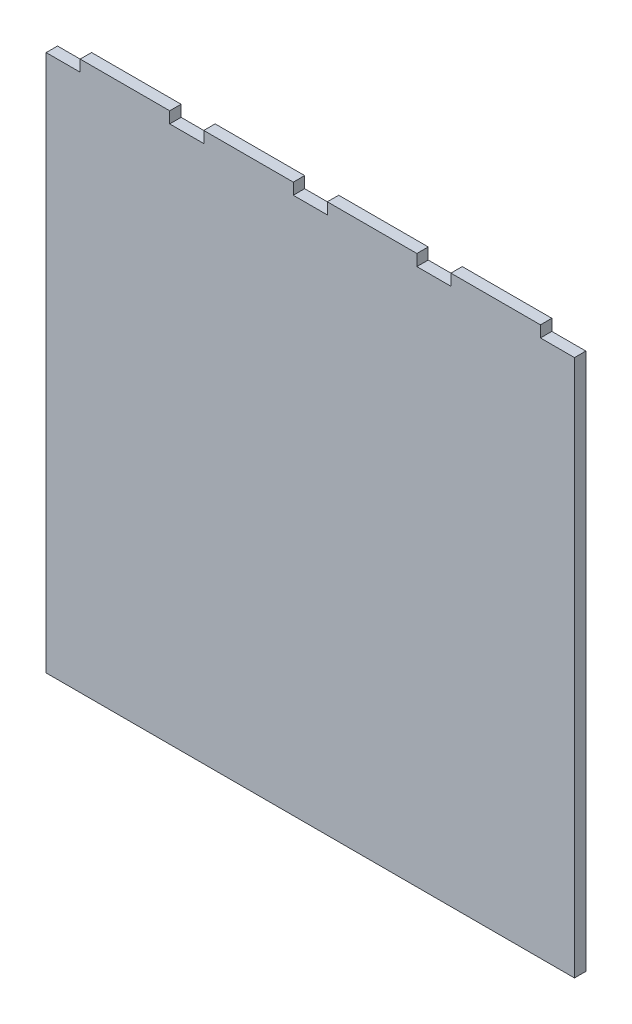
ISO-10303-21;
HEADER;
FILE_DESCRIPTION(('STEP AP214'),'2;1');
FILE_NAME('part.step','',(''),(''),'','','');
FILE_SCHEMA(('AUTOMOTIVE_DESIGN { 1 0 10303 214 1 1 1 1 }'));
ENDSEC;
DATA;
#1=APPLICATION_CONTEXT('core data for automotive mechanical design processes');
#2=APPLICATION_PROTOCOL_DEFINITION('international standard','automotive_design',2000,#1);
#3=PRODUCT_CONTEXT('',#1,'mechanical');
#4=PRODUCT('Part','Part','',(#3));
#5=PRODUCT_RELATED_PRODUCT_CATEGORY('part','',(#4));
#6=PRODUCT_DEFINITION_FORMATION('','',#4);
#7=PRODUCT_DEFINITION_CONTEXT('part definition',#1,'design');
#8=PRODUCT_DEFINITION('design','',#6,#7);
#9=PRODUCT_DEFINITION_SHAPE('','',#8);
#10=(LENGTH_UNIT() NAMED_UNIT(*) SI_UNIT(.MILLI.,.METRE.));
#11=(NAMED_UNIT(*) PLANE_ANGLE_UNIT() SI_UNIT($,.RADIAN.));
#12=(NAMED_UNIT(*) SI_UNIT($,.STERADIAN.) SOLID_ANGLE_UNIT());
#13=UNCERTAINTY_MEASURE_WITH_UNIT(LENGTH_MEASURE(1.E-05),#10,'distance_accuracy_value','');
#14=(GEOMETRIC_REPRESENTATION_CONTEXT(3) GLOBAL_UNCERTAINTY_ASSIGNED_CONTEXT((#13)) GLOBAL_UNIT_ASSIGNED_CONTEXT((#10,
#11,#12)) REPRESENTATION_CONTEXT('',''));
#15=CARTESIAN_POINT('',(0.,0.,0.));
#16=DIRECTION('',(0.,0.,1.));
#17=DIRECTION('',(1.,0.,0.));
#18=AXIS2_PLACEMENT_3D('',#15,#16,#17);
#19=CARTESIAN_POINT('',(0.,0.,6.35));
#20=DIRECTION('',(1.,0.,0.));
#21=DIRECTION('',(0.,1.,0.));
#22=AXIS2_PLACEMENT_3D('',#19,#20,#21);
#23=PLANE('',#22);
#24=DIRECTION('',(0.,-1.,0.));
#25=VECTOR('',#24,1.);
#26=CARTESIAN_POINT('',(0.,0.,0.));
#27=LINE('',#26,#25);
#28=CARTESIAN_POINT('',(0.,0.,0.));
#29=VERTEX_POINT('',#28);
#30=CARTESIAN_POINT('',(0.,-300.,0.));
#31=VERTEX_POINT('',#30);
#32=EDGE_CURVE('E201',#29,#31,#27,.T.);
#33=ORIENTED_EDGE('',*,*,#32,.T.);
#34=DIRECTION('',(0.,0.,-1.));
#35=VECTOR('',#34,1.);
#36=CARTESIAN_POINT('',(0.,-300.,6.35));
#37=LINE('',#36,#35);
#38=CARTESIAN_POINT('',(0.,-300.,6.35));
#39=VERTEX_POINT('',#38);
#40=EDGE_CURVE('E11',#39,#31,#37,.T.);
#41=ORIENTED_EDGE('',*,*,#40,.F.);
#42=DIRECTION('',(0.,-1.,0.));
#43=VECTOR('',#42,1.);
#44=CARTESIAN_POINT('',(0.,0.,6.35));
#45=LINE('',#44,#43);
#46=CARTESIAN_POINT('',(0.,0.,6.35));
#47=VERTEX_POINT('',#46);
#48=EDGE_CURVE('E239',#47,#39,#45,.T.);
#49=ORIENTED_EDGE('',*,*,#48,.F.);
#50=DIRECTION('',(0.,0.,-1.));
#51=VECTOR('',#50,1.);
#52=CARTESIAN_POINT('',(0.,0.,6.35));
#53=LINE('',#52,#51);
#54=EDGE_CURVE('E197',#47,#29,#53,.T.);
#55=ORIENTED_EDGE('',*,*,#54,.T.);
#56=EDGE_LOOP('',(#33,#41,#49,#55));
#57=FACE_BOUND('',#56,.T.);
#58=ADVANCED_FACE('F33',(#57),#23,.F.);
#59=CARTESIAN_POINT('',(0.,-300.,6.35));
#60=DIRECTION('',(0.,1.,0.));
#61=DIRECTION('',(0.,0.,1.));
#62=AXIS2_PLACEMENT_3D('',#59,#60,#61);
#63=PLANE('',#62);
#64=DIRECTION('',(1.,0.,0.));
#65=VECTOR('',#64,1.);
#66=CARTESIAN_POINT('',(0.,-300.,0.));
#67=LINE('',#66,#65);
#68=CARTESIAN_POINT('',(295.,-300.,0.));
#69=VERTEX_POINT('',#68);
#70=EDGE_CURVE('E204',#31,#69,#67,.T.);
#71=ORIENTED_EDGE('',*,*,#70,.T.);
#72=DIRECTION('',(0.,0.,-1.));
#73=VECTOR('',#72,1.);
#74=CARTESIAN_POINT('',(295.,-300.,6.35));
#75=LINE('',#74,#73);
#76=CARTESIAN_POINT('',(295.,-300.,6.35));
#77=VERTEX_POINT('',#76);
#78=EDGE_CURVE('E41',#77,#69,#75,.T.);
#79=ORIENTED_EDGE('',*,*,#78,.F.);
#80=DIRECTION('',(1.,0.,0.));
#81=VECTOR('',#80,1.);
#82=CARTESIAN_POINT('',(0.,-300.,6.35));
#83=LINE('',#82,#81);
#84=EDGE_CURVE('E128',#39,#77,#83,.T.);
#85=ORIENTED_EDGE('',*,*,#84,.F.);
#86=ORIENTED_EDGE('',*,*,#40,.T.);
#87=EDGE_LOOP('',(#71,#79,#85,#86));
#88=FACE_BOUND('',#87,.T.);
#89=ADVANCED_FACE('F357',(#88),#63,.F.);
#90=CARTESIAN_POINT('',(295.,0.,6.35));
#91=DIRECTION('',(-1.,0.,0.));
#92=DIRECTION('',(0.,-1.,0.));
#93=AXIS2_PLACEMENT_3D('',#90,#91,#92);
#94=PLANE('',#93);
#95=DIRECTION('',(0.,1.,0.));
#96=VECTOR('',#95,1.);
#97=CARTESIAN_POINT('',(295.,0.,0.));
#98=LINE('',#97,#96);
#99=CARTESIAN_POINT('',(295.,0.,0.));
#100=VERTEX_POINT('',#99);
#101=EDGE_CURVE('E206',#69,#100,#98,.T.);
#102=ORIENTED_EDGE('',*,*,#101,.T.);
#103=DIRECTION('',(0.,0.,-1.));
#104=VECTOR('',#103,1.);
#105=CARTESIAN_POINT('',(295.,0.,6.35));
#106=LINE('',#105,#104);
#107=CARTESIAN_POINT('',(295.,0.,6.35));
#108=VERTEX_POINT('',#107);
#109=EDGE_CURVE('E282',#108,#100,#106,.T.);
#110=ORIENTED_EDGE('',*,*,#109,.F.);
#111=DIRECTION('',(0.,1.,0.));
#112=VECTOR('',#111,1.);
#113=CARTESIAN_POINT('',(295.,0.,6.35));
#114=LINE('',#113,#112);
#115=EDGE_CURVE('E290',#77,#108,#114,.T.);
#116=ORIENTED_EDGE('',*,*,#115,.F.);
#117=ORIENTED_EDGE('',*,*,#78,.T.);
#118=EDGE_LOOP('',(#102,#110,#116,#117));
#119=FACE_BOUND('',#118,.T.);
#120=ADVANCED_FACE('F288',(#119),#94,.F.);
#121=CARTESIAN_POINT('',(276.,0.,6.35));
#122=DIRECTION('',(0.,-1.,0.));
#123=DIRECTION('',(0.,0.,-1.));
#124=AXIS2_PLACEMENT_3D('',#121,#122,#123);
#125=PLANE('',#124);
#126=DIRECTION('',(-1.,0.,0.));
#127=VECTOR('',#126,1.);
#128=CARTESIAN_POINT('',(276.,0.,0.));
#129=LINE('',#128,#127);
#130=CARTESIAN_POINT('',(276.,0.,0.));
#131=VERTEX_POINT('',#130);
#132=EDGE_CURVE('E208',#100,#131,#129,.T.);
#133=ORIENTED_EDGE('',*,*,#132,.T.);
#134=DIRECTION('',(0.,0.,-1.));
#135=VECTOR('',#134,1.);
#136=CARTESIAN_POINT('',(276.,0.,6.35));
#137=LINE('',#136,#135);
#138=CARTESIAN_POINT('',(276.,0.,6.35));
#139=VERTEX_POINT('',#138);
#140=EDGE_CURVE('E279',#139,#131,#137,.T.);
#141=ORIENTED_EDGE('',*,*,#140,.F.);
#142=DIRECTION('',(-1.,0.,0.));
#143=VECTOR('',#142,1.);
#144=CARTESIAN_POINT('',(276.,0.,6.35));
#145=LINE('',#144,#143);
#146=EDGE_CURVE('E308',#108,#139,#145,.T.);
#147=ORIENTED_EDGE('',*,*,#146,.F.);
#148=ORIENTED_EDGE('',*,*,#109,.T.);
#149=EDGE_LOOP('',(#133,#141,#147,#148));
#150=FACE_BOUND('',#149,.T.);
#151=ADVANCED_FACE('F299',(#150),#125,.F.);
#152=CARTESIAN_POINT('',(276.,0.,6.35));
#153=DIRECTION('',(-1.,0.,0.));
#154=DIRECTION('',(0.,0.,1.));
#155=AXIS2_PLACEMENT_3D('',#152,#153,#154);
#156=PLANE('',#155);
#157=DIRECTION('',(0.,1.,0.));
#158=VECTOR('',#157,1.);
#159=CARTESIAN_POINT('',(276.,0.,0.));
#160=LINE('',#159,#158);
#161=CARTESIAN_POINT('',(276.,6.35,0.));
#162=VERTEX_POINT('',#161);
#163=EDGE_CURVE('E210',#131,#162,#160,.T.);
#164=ORIENTED_EDGE('',*,*,#163,.T.);
#165=DIRECTION('',(0.,0.,-1.));
#166=VECTOR('',#165,1.);
#167=CARTESIAN_POINT('',(276.,6.35,6.35));
#168=LINE('',#167,#166);
#169=CARTESIAN_POINT('',(276.,6.35,6.35));
#170=VERTEX_POINT('',#169);
#171=EDGE_CURVE('E276',#170,#162,#168,.T.);
#172=ORIENTED_EDGE('',*,*,#171,.F.);
#173=DIRECTION('',(0.,1.,0.));
#174=VECTOR('',#173,1.);
#175=CARTESIAN_POINT('',(276.,0.,6.35));
#176=LINE('',#175,#174);
#177=EDGE_CURVE('E305',#139,#170,#176,.T.);
#178=ORIENTED_EDGE('',*,*,#177,.F.);
#179=ORIENTED_EDGE('',*,*,#140,.T.);
#180=EDGE_LOOP('',(#164,#172,#178,#179));
#181=FACE_BOUND('',#180,.T.);
#182=ADVANCED_FACE('F303',(#181),#156,.F.);
#183=CARTESIAN_POINT('',(226.,6.35,6.35));
#184=DIRECTION('',(0.,-1.,0.));
#185=DIRECTION('',(0.,0.,-1.));
#186=AXIS2_PLACEMENT_3D('',#183,#184,#185);
#187=PLANE('',#186);
#188=DIRECTION('',(-1.,0.,0.));
#189=VECTOR('',#188,1.);
#190=CARTESIAN_POINT('',(226.,6.35,0.));
#191=LINE('',#190,#189);
#192=CARTESIAN_POINT('',(226.,6.35,0.));
#193=VERTEX_POINT('',#192);
#194=EDGE_CURVE('E212',#162,#193,#191,.T.);
#195=ORIENTED_EDGE('',*,*,#194,.T.);
#196=DIRECTION('',(0.,0.,-1.));
#197=VECTOR('',#196,1.);
#198=CARTESIAN_POINT('',(226.,6.35,6.35));
#199=LINE('',#198,#197);
#200=CARTESIAN_POINT('',(226.,6.35,6.35));
#201=VERTEX_POINT('',#200);
#202=EDGE_CURVE('E273',#201,#193,#199,.T.);
#203=ORIENTED_EDGE('',*,*,#202,.F.);
#204=DIRECTION('',(-1.,0.,0.));
#205=VECTOR('',#204,1.);
#206=CARTESIAN_POINT('',(226.,6.35,6.35));
#207=LINE('',#206,#205);
#208=EDGE_CURVE('E307',#170,#201,#207,.T.);
#209=ORIENTED_EDGE('',*,*,#208,.F.);
#210=ORIENTED_EDGE('',*,*,#171,.T.);
#211=EDGE_LOOP('',(#195,#203,#209,#210));
#212=FACE_BOUND('',#211,.T.);
#213=ADVANCED_FACE('F370',(#212),#187,.F.);
#214=CARTESIAN_POINT('',(226.,0.,6.35));
#215=DIRECTION('',(1.,0.,0.));
#216=DIRECTION('',(0.,0.,-1.));
#217=AXIS2_PLACEMENT_3D('',#214,#215,#216);
#218=PLANE('',#217);
#219=DIRECTION('',(0.,-1.,0.));
#220=VECTOR('',#219,1.);
#221=CARTESIAN_POINT('',(226.,0.,0.));
#222=LINE('',#221,#220);
#223=CARTESIAN_POINT('',(226.,0.,0.));
#224=VERTEX_POINT('',#223);
#225=EDGE_CURVE('E214',#193,#224,#222,.T.);
#226=ORIENTED_EDGE('',*,*,#225,.T.);
#227=DIRECTION('',(0.,0.,-1.));
#228=VECTOR('',#227,1.);
#229=CARTESIAN_POINT('',(226.,0.,6.35));
#230=LINE('',#229,#228);
#231=CARTESIAN_POINT('',(226.,0.,6.35));
#232=VERTEX_POINT('',#231);
#233=EDGE_CURVE('E270',#232,#224,#230,.T.);
#234=ORIENTED_EDGE('',*,*,#233,.F.);
#235=DIRECTION('',(0.,-1.,0.));
#236=VECTOR('',#235,1.);
#237=CARTESIAN_POINT('',(226.,0.,6.35));
#238=LINE('',#237,#236);
#239=EDGE_CURVE('E310',#201,#232,#238,.T.);
#240=ORIENTED_EDGE('',*,*,#239,.F.);
#241=ORIENTED_EDGE('',*,*,#202,.T.);
#242=EDGE_LOOP('',(#226,#234,#240,#241));
#243=FACE_BOUND('',#242,.T.);
#244=ADVANCED_FACE('F373',(#243),#218,.F.);
#245=CARTESIAN_POINT('',(207.,0.,6.35));
#246=DIRECTION('',(0.,-1.,0.));
#247=DIRECTION('',(0.,0.,-1.));
#248=AXIS2_PLACEMENT_3D('',#245,#246,#247);
#249=PLANE('',#248);
#250=DIRECTION('',(-1.,0.,0.));
#251=VECTOR('',#250,1.);
#252=CARTESIAN_POINT('',(207.,0.,0.));
#253=LINE('',#252,#251);
#254=CARTESIAN_POINT('',(207.,0.,0.));
#255=VERTEX_POINT('',#254);
#256=EDGE_CURVE('E216',#224,#255,#253,.T.);
#257=ORIENTED_EDGE('',*,*,#256,.T.);
#258=DIRECTION('',(0.,0.,-1.));
#259=VECTOR('',#258,1.);
#260=CARTESIAN_POINT('',(207.,0.,6.35));
#261=LINE('',#260,#259);
#262=CARTESIAN_POINT('',(207.,0.,6.35));
#263=VERTEX_POINT('',#262);
#264=EDGE_CURVE('E267',#263,#255,#261,.T.);
#265=ORIENTED_EDGE('',*,*,#264,.F.);
#266=DIRECTION('',(-1.,0.,0.));
#267=VECTOR('',#266,1.);
#268=CARTESIAN_POINT('',(207.,0.,6.35));
#269=LINE('',#268,#267);
#270=EDGE_CURVE('E316',#232,#263,#269,.T.);
#271=ORIENTED_EDGE('',*,*,#270,.F.);
#272=ORIENTED_EDGE('',*,*,#233,.T.);
#273=EDGE_LOOP('',(#257,#265,#271,#272));
#274=FACE_BOUND('',#273,.T.);
#275=ADVANCED_FACE('F377',(#274),#249,.F.);
#276=CARTESIAN_POINT('',(207.,0.,6.35));
#277=DIRECTION('',(-1.,0.,0.));
#278=DIRECTION('',(0.,0.,1.));
#279=AXIS2_PLACEMENT_3D('',#276,#277,#278);
#280=PLANE('',#279);
#281=DIRECTION('',(0.,1.,0.));
#282=VECTOR('',#281,1.);
#283=CARTESIAN_POINT('',(207.,0.,0.));
#284=LINE('',#283,#282);
#285=CARTESIAN_POINT('',(207.,6.35,0.));
#286=VERTEX_POINT('',#285);
#287=EDGE_CURVE('E218',#255,#286,#284,.T.);
#288=ORIENTED_EDGE('',*,*,#287,.T.);
#289=DIRECTION('',(0.,0.,-1.));
#290=VECTOR('',#289,1.);
#291=CARTESIAN_POINT('',(207.,6.35,6.35));
#292=LINE('',#291,#290);
#293=CARTESIAN_POINT('',(207.,6.35,6.35));
#294=VERTEX_POINT('',#293);
#295=EDGE_CURVE('E264',#294,#286,#292,.T.);
#296=ORIENTED_EDGE('',*,*,#295,.F.);
#297=DIRECTION('',(0.,1.,0.));
#298=VECTOR('',#297,1.);
#299=CARTESIAN_POINT('',(207.,0.,6.35));
#300=LINE('',#299,#298);
#301=EDGE_CURVE('E318',#263,#294,#300,.T.);
#302=ORIENTED_EDGE('',*,*,#301,.F.);
#303=ORIENTED_EDGE('',*,*,#264,.T.);
#304=EDGE_LOOP('',(#288,#296,#302,#303));
#305=FACE_BOUND('',#304,.T.);
#306=ADVANCED_FACE('F381',(#305),#280,.F.);
#307=CARTESIAN_POINT('',(157.,6.35,6.35));
#308=DIRECTION('',(0.,-1.,0.));
#309=DIRECTION('',(0.,0.,-1.));
#310=AXIS2_PLACEMENT_3D('',#307,#308,#309);
#311=PLANE('',#310);
#312=DIRECTION('',(-1.,0.,0.));
#313=VECTOR('',#312,1.);
#314=CARTESIAN_POINT('',(157.,6.35,0.));
#315=LINE('',#314,#313);
#316=CARTESIAN_POINT('',(157.,6.35,0.));
#317=VERTEX_POINT('',#316);
#318=EDGE_CURVE('E220',#286,#317,#315,.T.);
#319=ORIENTED_EDGE('',*,*,#318,.T.);
#320=DIRECTION('',(0.,0.,-1.));
#321=VECTOR('',#320,1.);
#322=CARTESIAN_POINT('',(157.,6.35,6.35));
#323=LINE('',#322,#321);
#324=CARTESIAN_POINT('',(157.,6.35,6.35));
#325=VERTEX_POINT('',#324);
#326=EDGE_CURVE('E261',#325,#317,#323,.T.);
#327=ORIENTED_EDGE('',*,*,#326,.F.);
#328=DIRECTION('',(-1.,0.,0.));
#329=VECTOR('',#328,1.);
#330=CARTESIAN_POINT('',(157.,6.35,6.35));
#331=LINE('',#330,#329);
#332=EDGE_CURVE('E320',#294,#325,#331,.T.);
#333=ORIENTED_EDGE('',*,*,#332,.F.);
#334=ORIENTED_EDGE('',*,*,#295,.T.);
#335=EDGE_LOOP('',(#319,#327,#333,#334));
#336=FACE_BOUND('',#335,.T.);
#337=ADVANCED_FACE('F385',(#336),#311,.F.);
#338=CARTESIAN_POINT('',(157.,0.,6.35));
#339=DIRECTION('',(1.,0.,0.));
#340=DIRECTION('',(0.,0.,-1.));
#341=AXIS2_PLACEMENT_3D('',#338,#339,#340);
#342=PLANE('',#341);
#343=DIRECTION('',(0.,-1.,0.));
#344=VECTOR('',#343,1.);
#345=CARTESIAN_POINT('',(157.,0.,0.));
#346=LINE('',#345,#344);
#347=CARTESIAN_POINT('',(157.,0.,0.));
#348=VERTEX_POINT('',#347);
#349=EDGE_CURVE('E222',#317,#348,#346,.T.);
#350=ORIENTED_EDGE('',*,*,#349,.T.);
#351=DIRECTION('',(0.,0.,-1.));
#352=VECTOR('',#351,1.);
#353=CARTESIAN_POINT('',(157.,0.,6.35));
#354=LINE('',#353,#352);
#355=CARTESIAN_POINT('',(157.,0.,6.35));
#356=VERTEX_POINT('',#355);
#357=EDGE_CURVE('E258',#356,#348,#354,.T.);
#358=ORIENTED_EDGE('',*,*,#357,.F.);
#359=DIRECTION('',(0.,-1.,0.));
#360=VECTOR('',#359,1.);
#361=CARTESIAN_POINT('',(157.,0.,6.35));
#362=LINE('',#361,#360);
#363=EDGE_CURVE('E322',#325,#356,#362,.T.);
#364=ORIENTED_EDGE('',*,*,#363,.F.);
#365=ORIENTED_EDGE('',*,*,#326,.T.);
#366=EDGE_LOOP('',(#350,#358,#364,#365));
#367=FACE_BOUND('',#366,.T.);
#368=ADVANCED_FACE('F389',(#367),#342,.F.);
#369=CARTESIAN_POINT('',(138.,0.,6.35));
#370=DIRECTION('',(0.,-1.,0.));
#371=DIRECTION('',(0.,0.,-1.));
#372=AXIS2_PLACEMENT_3D('',#369,#370,#371);
#373=PLANE('',#372);
#374=DIRECTION('',(-1.,0.,0.));
#375=VECTOR('',#374,1.);
#376=CARTESIAN_POINT('',(138.,0.,0.));
#377=LINE('',#376,#375);
#378=CARTESIAN_POINT('',(138.,0.,0.));
#379=VERTEX_POINT('',#378);
#380=EDGE_CURVE('E224',#348,#379,#377,.T.);
#381=ORIENTED_EDGE('',*,*,#380,.T.);
#382=DIRECTION('',(0.,0.,-1.));
#383=VECTOR('',#382,1.);
#384=CARTESIAN_POINT('',(138.,0.,6.35));
#385=LINE('',#384,#383);
#386=CARTESIAN_POINT('',(138.,0.,6.35));
#387=VERTEX_POINT('',#386);
#388=EDGE_CURVE('E255',#387,#379,#385,.T.);
#389=ORIENTED_EDGE('',*,*,#388,.F.);
#390=DIRECTION('',(-1.,0.,0.));
#391=VECTOR('',#390,1.);
#392=CARTESIAN_POINT('',(138.,0.,6.35));
#393=LINE('',#392,#391);
#394=EDGE_CURVE('E324',#356,#387,#393,.T.);
#395=ORIENTED_EDGE('',*,*,#394,.F.);
#396=ORIENTED_EDGE('',*,*,#357,.T.);
#397=EDGE_LOOP('',(#381,#389,#395,#396));
#398=FACE_BOUND('',#397,.T.);
#399=ADVANCED_FACE('F393',(#398),#373,.F.);
#400=CARTESIAN_POINT('',(138.,0.,6.35));
#401=DIRECTION('',(-1.,0.,0.));
#402=DIRECTION('',(0.,0.,1.));
#403=AXIS2_PLACEMENT_3D('',#400,#401,#402);
#404=PLANE('',#403);
#405=DIRECTION('',(0.,1.,0.));
#406=VECTOR('',#405,1.);
#407=CARTESIAN_POINT('',(138.,0.,0.));
#408=LINE('',#407,#406);
#409=CARTESIAN_POINT('',(138.,6.35,0.));
#410=VERTEX_POINT('',#409);
#411=EDGE_CURVE('E226',#379,#410,#408,.T.);
#412=ORIENTED_EDGE('',*,*,#411,.T.);
#413=DIRECTION('',(0.,0.,-1.));
#414=VECTOR('',#413,1.);
#415=CARTESIAN_POINT('',(138.,6.35,6.35));
#416=LINE('',#415,#414);
#417=CARTESIAN_POINT('',(138.,6.35,6.35));
#418=VERTEX_POINT('',#417);
#419=EDGE_CURVE('E252',#418,#410,#416,.T.);
#420=ORIENTED_EDGE('',*,*,#419,.F.);
#421=DIRECTION('',(0.,1.,0.));
#422=VECTOR('',#421,1.);
#423=CARTESIAN_POINT('',(138.,0.,6.35));
#424=LINE('',#423,#422);
#425=EDGE_CURVE('E326',#387,#418,#424,.T.);
#426=ORIENTED_EDGE('',*,*,#425,.F.);
#427=ORIENTED_EDGE('',*,*,#388,.T.);
#428=EDGE_LOOP('',(#412,#420,#426,#427));
#429=FACE_BOUND('',#428,.T.);
#430=ADVANCED_FACE('F397',(#429),#404,.F.);
#431=CARTESIAN_POINT('',(88.,6.35,6.35));
#432=DIRECTION('',(0.,-1.,0.));
#433=DIRECTION('',(0.,0.,-1.));
#434=AXIS2_PLACEMENT_3D('',#431,#432,#433);
#435=PLANE('',#434);
#436=DIRECTION('',(-1.,0.,0.));
#437=VECTOR('',#436,1.);
#438=CARTESIAN_POINT('',(88.,6.35,0.));
#439=LINE('',#438,#437);
#440=CARTESIAN_POINT('',(88.,6.35,0.));
#441=VERTEX_POINT('',#440);
#442=EDGE_CURVE('E228',#410,#441,#439,.T.);
#443=ORIENTED_EDGE('',*,*,#442,.T.);
#444=DIRECTION('',(0.,0.,-1.));
#445=VECTOR('',#444,1.);
#446=CARTESIAN_POINT('',(88.,6.35,6.35));
#447=LINE('',#446,#445);
#448=CARTESIAN_POINT('',(88.,6.35,6.35));
#449=VERTEX_POINT('',#448);
#450=EDGE_CURVE('E249',#449,#441,#447,.T.);
#451=ORIENTED_EDGE('',*,*,#450,.F.);
#452=DIRECTION('',(-1.,0.,0.));
#453=VECTOR('',#452,1.);
#454=CARTESIAN_POINT('',(88.,6.35,6.35));
#455=LINE('',#454,#453);
#456=EDGE_CURVE('E328',#418,#449,#455,.T.);
#457=ORIENTED_EDGE('',*,*,#456,.F.);
#458=ORIENTED_EDGE('',*,*,#419,.T.);
#459=EDGE_LOOP('',(#443,#451,#457,#458));
#460=FACE_BOUND('',#459,.T.);
#461=ADVANCED_FACE('F401',(#460),#435,.F.);
#462=CARTESIAN_POINT('',(88.,0.,6.35));
#463=DIRECTION('',(1.,0.,0.));
#464=DIRECTION('',(0.,0.,-1.));
#465=AXIS2_PLACEMENT_3D('',#462,#463,#464);
#466=PLANE('',#465);
#467=DIRECTION('',(0.,-1.,0.));
#468=VECTOR('',#467,1.);
#469=CARTESIAN_POINT('',(88.,0.,0.));
#470=LINE('',#469,#468);
#471=CARTESIAN_POINT('',(88.,0.,0.));
#472=VERTEX_POINT('',#471);
#473=EDGE_CURVE('E230',#441,#472,#470,.T.);
#474=ORIENTED_EDGE('',*,*,#473,.T.);
#475=DIRECTION('',(0.,0.,-1.));
#476=VECTOR('',#475,1.);
#477=CARTESIAN_POINT('',(88.,0.,6.35));
#478=LINE('',#477,#476);
#479=CARTESIAN_POINT('',(88.,0.,6.35));
#480=VERTEX_POINT('',#479);
#481=EDGE_CURVE('E246',#480,#472,#478,.T.);
#482=ORIENTED_EDGE('',*,*,#481,.F.);
#483=DIRECTION('',(0.,-1.,0.));
#484=VECTOR('',#483,1.);
#485=CARTESIAN_POINT('',(88.,0.,6.35));
#486=LINE('',#485,#484);
#487=EDGE_CURVE('E330',#449,#480,#486,.T.);
#488=ORIENTED_EDGE('',*,*,#487,.F.);
#489=ORIENTED_EDGE('',*,*,#450,.T.);
#490=EDGE_LOOP('',(#474,#482,#488,#489));
#491=FACE_BOUND('',#490,.T.);
#492=ADVANCED_FACE('F405',(#491),#466,.F.);
#493=CARTESIAN_POINT('',(69.,0.,6.35));
#494=DIRECTION('',(0.,-1.,0.));
#495=DIRECTION('',(0.,0.,-1.));
#496=AXIS2_PLACEMENT_3D('',#493,#494,#495);
#497=PLANE('',#496);
#498=DIRECTION('',(-1.,0.,0.));
#499=VECTOR('',#498,1.);
#500=CARTESIAN_POINT('',(69.,0.,0.));
#501=LINE('',#500,#499);
#502=CARTESIAN_POINT('',(69.,0.,0.));
#503=VERTEX_POINT('',#502);
#504=EDGE_CURVE('E232',#472,#503,#501,.T.);
#505=ORIENTED_EDGE('',*,*,#504,.T.);
#506=DIRECTION('',(0.,0.,-1.));
#507=VECTOR('',#506,1.);
#508=CARTESIAN_POINT('',(69.,0.,6.35));
#509=LINE('',#508,#507);
#510=CARTESIAN_POINT('',(69.,0.,6.35));
#511=VERTEX_POINT('',#510);
#512=EDGE_CURVE('E243',#511,#503,#509,.T.);
#513=ORIENTED_EDGE('',*,*,#512,.F.);
#514=DIRECTION('',(-1.,0.,0.));
#515=VECTOR('',#514,1.);
#516=CARTESIAN_POINT('',(69.,0.,6.35));
#517=LINE('',#516,#515);
#518=EDGE_CURVE('E332',#480,#511,#517,.T.);
#519=ORIENTED_EDGE('',*,*,#518,.F.);
#520=ORIENTED_EDGE('',*,*,#481,.T.);
#521=EDGE_LOOP('',(#505,#513,#519,#520));
#522=FACE_BOUND('',#521,.T.);
#523=ADVANCED_FACE('F338',(#522),#497,.F.);
#524=CARTESIAN_POINT('',(69.,0.,6.35));
#525=DIRECTION('',(-1.,0.,0.));
#526=DIRECTION('',(0.,0.,1.));
#527=AXIS2_PLACEMENT_3D('',#524,#525,#526);
#528=PLANE('',#527);
#529=DIRECTION('',(0.,1.,0.));
#530=VECTOR('',#529,1.);
#531=CARTESIAN_POINT('',(69.,0.,0.));
#532=LINE('',#531,#530);
#533=CARTESIAN_POINT('',(69.,6.35,0.));
#534=VERTEX_POINT('',#533);
#535=EDGE_CURVE('E234',#503,#534,#532,.T.);
#536=ORIENTED_EDGE('',*,*,#535,.T.);
#537=DIRECTION('',(0.,0.,-1.));
#538=VECTOR('',#537,1.);
#539=CARTESIAN_POINT('',(69.,6.35,6.35));
#540=LINE('',#539,#538);
#541=CARTESIAN_POINT('',(69.,6.35,6.35));
#542=VERTEX_POINT('',#541);
#543=EDGE_CURVE('E192',#542,#534,#540,.T.);
#544=ORIENTED_EDGE('',*,*,#543,.F.);
#545=DIRECTION('',(0.,1.,0.));
#546=VECTOR('',#545,1.);
#547=CARTESIAN_POINT('',(69.,0.,6.35));
#548=LINE('',#547,#546);
#549=EDGE_CURVE('E183',#511,#542,#548,.T.);
#550=ORIENTED_EDGE('',*,*,#549,.F.);
#551=ORIENTED_EDGE('',*,*,#512,.T.);
#552=EDGE_LOOP('',(#536,#544,#550,#551));
#553=FACE_BOUND('',#552,.T.);
#554=ADVANCED_FACE('F342',(#553),#528,.F.);
#555=CARTESIAN_POINT('',(19.,6.35,6.35));
#556=DIRECTION('',(0.,-1.,0.));
#557=DIRECTION('',(0.,0.,-1.));
#558=AXIS2_PLACEMENT_3D('',#555,#556,#557);
#559=PLANE('',#558);
#560=DIRECTION('',(-1.,0.,0.));
#561=VECTOR('',#560,1.);
#562=CARTESIAN_POINT('',(19.,6.35,0.));
#563=LINE('',#562,#561);
#564=CARTESIAN_POINT('',(19.,6.35,0.));
#565=VERTEX_POINT('',#564);
#566=EDGE_CURVE('E191',#534,#565,#563,.T.);
#567=ORIENTED_EDGE('',*,*,#566,.T.);
#568=DIRECTION('',(0.,0.,-1.));
#569=VECTOR('',#568,1.);
#570=CARTESIAN_POINT('',(19.,6.35,6.35));
#571=LINE('',#570,#569);
#572=CARTESIAN_POINT('',(19.,6.35,6.35));
#573=VERTEX_POINT('',#572);
#574=EDGE_CURVE('E188',#573,#565,#571,.T.);
#575=ORIENTED_EDGE('',*,*,#574,.F.);
#576=DIRECTION('',(-1.,0.,0.));
#577=VECTOR('',#576,1.);
#578=CARTESIAN_POINT('',(19.,6.35,6.35));
#579=LINE('',#578,#577);
#580=EDGE_CURVE('E177',#542,#573,#579,.T.);
#581=ORIENTED_EDGE('',*,*,#580,.F.);
#582=ORIENTED_EDGE('',*,*,#543,.T.);
#583=EDGE_LOOP('',(#567,#575,#581,#582));
#584=FACE_BOUND('',#583,.T.);
#585=ADVANCED_FACE('F189',(#584),#559,.F.);
#586=CARTESIAN_POINT('',(19.,0.,6.35));
#587=DIRECTION('',(1.,0.,0.));
#588=DIRECTION('',(0.,0.,-1.));
#589=AXIS2_PLACEMENT_3D('',#586,#587,#588);
#590=PLANE('',#589);
#591=DIRECTION('',(0.,-1.,0.));
#592=VECTOR('',#591,1.);
#593=CARTESIAN_POINT('',(19.,0.,0.));
#594=LINE('',#593,#592);
#595=CARTESIAN_POINT('',(19.,0.,0.));
#596=VERTEX_POINT('',#595);
#597=EDGE_CURVE('E114',#565,#596,#594,.T.);
#598=ORIENTED_EDGE('',*,*,#597,.T.);
#599=DIRECTION('',(0.,0.,-1.));
#600=VECTOR('',#599,1.);
#601=CARTESIAN_POINT('',(19.,0.,6.35));
#602=LINE('',#601,#600);
#603=CARTESIAN_POINT('',(19.,0.,6.35));
#604=VERTEX_POINT('',#603);
#605=EDGE_CURVE('E193',#604,#596,#602,.T.);
#606=ORIENTED_EDGE('',*,*,#605,.F.);
#607=DIRECTION('',(0.,-1.,0.));
#608=VECTOR('',#607,1.);
#609=CARTESIAN_POINT('',(19.,0.,6.35));
#610=LINE('',#609,#608);
#611=EDGE_CURVE('E181',#573,#604,#610,.T.);
#612=ORIENTED_EDGE('',*,*,#611,.F.);
#613=ORIENTED_EDGE('',*,*,#574,.T.);
#614=EDGE_LOOP('',(#598,#606,#612,#613));
#615=FACE_BOUND('',#614,.T.);
#616=ADVANCED_FACE('F195',(#615),#590,.F.);
#617=CARTESIAN_POINT('',(0.,0.,6.35));
#618=DIRECTION('',(0.,-1.,0.));
#619=DIRECTION('',(0.,0.,-1.));
#620=AXIS2_PLACEMENT_3D('',#617,#618,#619);
#621=PLANE('',#620);
#622=DIRECTION('',(-1.,0.,0.));
#623=VECTOR('',#622,1.);
#624=CARTESIAN_POINT('',(0.,0.,0.));
#625=LINE('',#624,#623);
#626=EDGE_CURVE('E120',#596,#29,#625,.T.);
#627=ORIENTED_EDGE('',*,*,#626,.T.);
#628=ORIENTED_EDGE('',*,*,#54,.F.);
#629=DIRECTION('',(-1.,0.,0.));
#630=VECTOR('',#629,1.);
#631=CARTESIAN_POINT('',(0.,0.,6.35));
#632=LINE('',#631,#630);
#633=EDGE_CURVE('E49',#604,#47,#632,.T.);
#634=ORIENTED_EDGE('',*,*,#633,.F.);
#635=ORIENTED_EDGE('',*,*,#605,.T.);
#636=EDGE_LOOP('',(#627,#628,#634,#635));
#637=FACE_BOUND('',#636,.T.);
#638=ADVANCED_FACE('F346',(#637),#621,.F.);
#639=CARTESIAN_POINT('',(0.,0.,6.35));
#640=DIRECTION('',(0.,0.,1.));
#641=DIRECTION('',(1.,0.,0.));
#642=AXIS2_PLACEMENT_3D('',#639,#640,#641);
#643=PLANE('',#642);
#644=ORIENTED_EDGE('',*,*,#48,.T.);
#645=ORIENTED_EDGE('',*,*,#84,.T.);
#646=ORIENTED_EDGE('',*,*,#115,.T.);
#647=ORIENTED_EDGE('',*,*,#146,.T.);
#648=ORIENTED_EDGE('',*,*,#177,.T.);
#649=ORIENTED_EDGE('',*,*,#208,.T.);
#650=ORIENTED_EDGE('',*,*,#239,.T.);
#651=ORIENTED_EDGE('',*,*,#270,.T.);
#652=ORIENTED_EDGE('',*,*,#301,.T.);
#653=ORIENTED_EDGE('',*,*,#332,.T.);
#654=ORIENTED_EDGE('',*,*,#363,.T.);
#655=ORIENTED_EDGE('',*,*,#394,.T.);
#656=ORIENTED_EDGE('',*,*,#425,.T.);
#657=ORIENTED_EDGE('',*,*,#456,.T.);
#658=ORIENTED_EDGE('',*,*,#487,.T.);
#659=ORIENTED_EDGE('',*,*,#518,.T.);
#660=ORIENTED_EDGE('',*,*,#549,.T.);
#661=ORIENTED_EDGE('',*,*,#580,.T.);
#662=ORIENTED_EDGE('',*,*,#611,.T.);
#663=ORIENTED_EDGE('',*,*,#633,.T.);
#664=EDGE_LOOP('',(#644,#645,#646,#647,#648,#649,#650,#651,#652,#653,#654,#655,#656,#657,#658,
#659,#660,#661,#662,#663));
#665=FACE_BOUND('',#664,.T.);
#666=ADVANCED_FACE('F179',(#665),#643,.T.);
#667=CARTESIAN_POINT('',(0.,0.,0.));
#668=DIRECTION('',(0.,0.,1.));
#669=DIRECTION('',(1.,0.,0.));
#670=AXIS2_PLACEMENT_3D('',#667,#668,#669);
#671=PLANE('',#670);
#672=ORIENTED_EDGE('',*,*,#32,.F.);
#673=ORIENTED_EDGE('',*,*,#626,.F.);
#674=ORIENTED_EDGE('',*,*,#597,.F.);
#675=ORIENTED_EDGE('',*,*,#566,.F.);
#676=ORIENTED_EDGE('',*,*,#535,.F.);
#677=ORIENTED_EDGE('',*,*,#504,.F.);
#678=ORIENTED_EDGE('',*,*,#473,.F.);
#679=ORIENTED_EDGE('',*,*,#442,.F.);
#680=ORIENTED_EDGE('',*,*,#411,.F.);
#681=ORIENTED_EDGE('',*,*,#380,.F.);
#682=ORIENTED_EDGE('',*,*,#349,.F.);
#683=ORIENTED_EDGE('',*,*,#318,.F.);
#684=ORIENTED_EDGE('',*,*,#287,.F.);
#685=ORIENTED_EDGE('',*,*,#256,.F.);
#686=ORIENTED_EDGE('',*,*,#225,.F.);
#687=ORIENTED_EDGE('',*,*,#194,.F.);
#688=ORIENTED_EDGE('',*,*,#163,.F.);
#689=ORIENTED_EDGE('',*,*,#132,.F.);
#690=ORIENTED_EDGE('',*,*,#101,.F.);
#691=ORIENTED_EDGE('',*,*,#70,.F.);
#692=EDGE_LOOP('',(#672,#673,#674,#675,#676,#677,#678,#679,#680,#681,#682,#683,#684,#685,#686,
#687,#688,#689,#690,#691));
#693=FACE_BOUND('',#692,.T.);
#694=ADVANCED_FACE('F294',(#693),#671,.F.);
#695=CLOSED_SHELL('',(#58,#89,#120,#151,#182,#213,#244,#275,#306,#337,#368,#399,#430,#461,#492,
#523,#554,#585,#616,#638,#666,#694));
#696=MANIFOLD_SOLID_BREP('B2',#695);
#697=ADVANCED_BREP_SHAPE_REPRESENTATION('',(#18,#696),#14);
#698=SHAPE_DEFINITION_REPRESENTATION(#9,#697);
ENDSEC;
END-ISO-10303-21;
